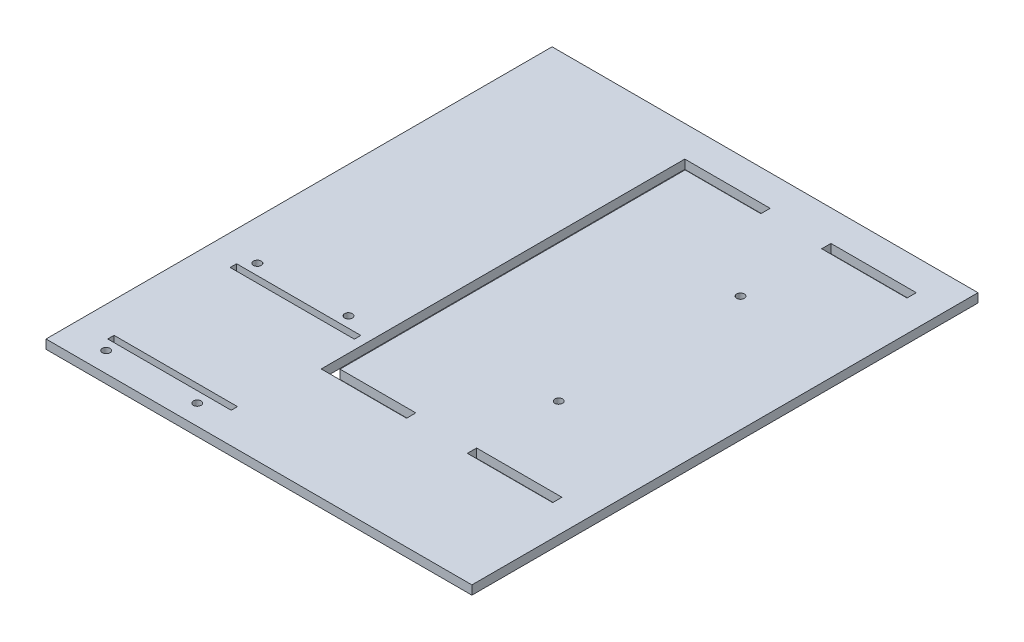
ISO-10303-21;
HEADER;
FILE_DESCRIPTION(('STEP AP214'),'2;1');
FILE_NAME('part.step','',(''),(''),'','','');
FILE_SCHEMA(('AUTOMOTIVE_DESIGN { 1 0 10303 214 1 1 1 1 }'));
ENDSEC;
DATA;
#1=APPLICATION_CONTEXT('core data for automotive mechanical design processes');
#2=APPLICATION_PROTOCOL_DEFINITION('international standard','automotive_design',2000,#1);
#3=PRODUCT_CONTEXT('',#1,'mechanical');
#4=PRODUCT('Part','Part','',(#3));
#5=PRODUCT_RELATED_PRODUCT_CATEGORY('part','',(#4));
#6=PRODUCT_DEFINITION_FORMATION('','',#4);
#7=PRODUCT_DEFINITION_CONTEXT('part definition',#1,'design');
#8=PRODUCT_DEFINITION('design','',#6,#7);
#9=PRODUCT_DEFINITION_SHAPE('','',#8);
#10=(LENGTH_UNIT() NAMED_UNIT(*) SI_UNIT(.MILLI.,.METRE.));
#11=(NAMED_UNIT(*) PLANE_ANGLE_UNIT() SI_UNIT($,.RADIAN.));
#12=(NAMED_UNIT(*) SI_UNIT($,.STERADIAN.) SOLID_ANGLE_UNIT());
#13=UNCERTAINTY_MEASURE_WITH_UNIT(LENGTH_MEASURE(1.E-05),#10,'distance_accuracy_value','');
#14=(GEOMETRIC_REPRESENTATION_CONTEXT(3) GLOBAL_UNCERTAINTY_ASSIGNED_CONTEXT((#13)) GLOBAL_UNIT_ASSIGNED_CONTEXT((#10,
#11,#12)) REPRESENTATION_CONTEXT('',''));
#15=CARTESIAN_POINT('',(0.,0.,0.));
#16=DIRECTION('',(0.,0.,1.));
#17=DIRECTION('',(1.,0.,0.));
#18=AXIS2_PLACEMENT_3D('',#15,#16,#17);
#19=CARTESIAN_POINT('',(0.,217.220590658261,352.461404447566));
#20=DIRECTION('',(0.,0.,-1.));
#21=DIRECTION('',(-1.,0.,0.));
#22=AXIS2_PLACEMENT_3D('',#19,#20,#21);
#23=PLANE('',#22);
#24=DIRECTION('',(0.,-1.,0.));
#25=VECTOR('',#24,1.);
#26=CARTESIAN_POINT('',(-40.25,217.220590658261,352.461404447566));
#27=LINE('',#26,#25);
#28=CARTESIAN_POINT('',(-40.25,2.90000000000001,352.461404447566));
#29=VERTEX_POINT('',#28);
#30=CARTESIAN_POINT('',(-40.25,0.,352.461404447566));
#31=VERTEX_POINT('',#30);
#32=EDGE_CURVE('E305',#29,#31,#27,.T.);
#33=ORIENTED_EDGE('',*,*,#32,.F.);
#34=DIRECTION('',(1.,0.,0.));
#35=VECTOR('',#34,1.);
#36=CARTESIAN_POINT('',(0.,2.90000000000001,352.461404447566));
#37=LINE('',#36,#35);
#38=CARTESIAN_POINT('',(0.,2.90000000000001,352.461404447566));
#39=VERTEX_POINT('',#38);
#40=EDGE_CURVE('E541',#29,#39,#37,.T.);
#41=ORIENTED_EDGE('',*,*,#40,.T.);
#42=DIRECTION('',(0.,-1.,0.));
#43=VECTOR('',#42,1.);
#44=CARTESIAN_POINT('',(0.,217.220590658261,352.461404447566));
#45=LINE('',#44,#43);
#46=CARTESIAN_POINT('',(0.,0.,352.461404447566));
#47=VERTEX_POINT('',#46);
#48=EDGE_CURVE('E303',#39,#47,#45,.T.);
#49=ORIENTED_EDGE('',*,*,#48,.T.);
#50=DIRECTION('',(1.,0.,0.));
#51=VECTOR('',#50,1.);
#52=CARTESIAN_POINT('',(0.,0.,352.461404447566));
#53=LINE('',#52,#51);
#54=EDGE_CURVE('E300',#31,#47,#53,.T.);
#55=ORIENTED_EDGE('',*,*,#54,.F.);
#56=EDGE_LOOP('',(#33,#41,#49,#55));
#57=FACE_BOUND('',#56,.T.);
#58=ADVANCED_FACE('F38',(#57),#23,.T.);
#59=CARTESIAN_POINT('',(-40.25,217.220590658261,350.361404447566));
#60=DIRECTION('',(1.,0.,0.));
#61=DIRECTION('',(0.,0.,-1.));
#62=AXIS2_PLACEMENT_3D('',#59,#60,#61);
#63=PLANE('',#62);
#64=DIRECTION('',(0.,-1.,0.));
#65=VECTOR('',#64,1.);
#66=CARTESIAN_POINT('',(-40.25,217.220590658261,350.361404447566));
#67=LINE('',#66,#65);
#68=CARTESIAN_POINT('',(-40.25,2.90000000000001,350.361404447566));
#69=VERTEX_POINT('',#68);
#70=CARTESIAN_POINT('',(-40.25,0.,350.361404447566));
#71=VERTEX_POINT('',#70);
#72=EDGE_CURVE('E307',#69,#71,#67,.T.);
#73=ORIENTED_EDGE('',*,*,#72,.F.);
#74=DIRECTION('',(0.,0.,1.));
#75=VECTOR('',#74,1.);
#76=CARTESIAN_POINT('',(-40.25,2.90000000000001,350.361404447566));
#77=LINE('',#76,#75);
#78=EDGE_CURVE('E544',#69,#29,#77,.T.);
#79=ORIENTED_EDGE('',*,*,#78,.T.);
#80=ORIENTED_EDGE('',*,*,#32,.T.);
#81=DIRECTION('',(0.,0.,1.));
#82=VECTOR('',#81,1.);
#83=CARTESIAN_POINT('',(-40.25,0.,350.361404447566));
#84=LINE('',#83,#82);
#85=EDGE_CURVE('E297',#71,#31,#84,.T.);
#86=ORIENTED_EDGE('',*,*,#85,.F.);
#87=EDGE_LOOP('',(#73,#79,#80,#86));
#88=FACE_BOUND('',#87,.T.);
#89=ADVANCED_FACE('F460',(#88),#63,.T.);
#90=CARTESIAN_POINT('',(0.,217.220590658261,350.361404447566));
#91=DIRECTION('',(0.,0.,1.));
#92=DIRECTION('',(1.,0.,0.));
#93=AXIS2_PLACEMENT_3D('',#90,#91,#92);
#94=PLANE('',#93);
#95=DIRECTION('',(0.,-1.,0.));
#96=VECTOR('',#95,1.);
#97=CARTESIAN_POINT('',(0.,217.220590658261,350.361404447566));
#98=LINE('',#97,#96);
#99=CARTESIAN_POINT('',(0.,2.90000000000001,350.361404447566));
#100=VERTEX_POINT('',#99);
#101=CARTESIAN_POINT('',(0.,0.,350.361404447566));
#102=VERTEX_POINT('',#101);
#103=EDGE_CURVE('E309',#100,#102,#98,.T.);
#104=ORIENTED_EDGE('',*,*,#103,.F.);
#105=DIRECTION('',(-1.,0.,0.));
#106=VECTOR('',#105,1.);
#107=CARTESIAN_POINT('',(0.,2.90000000000001,350.361404447566));
#108=LINE('',#107,#106);
#109=EDGE_CURVE('E550',#100,#69,#108,.T.);
#110=ORIENTED_EDGE('',*,*,#109,.T.);
#111=ORIENTED_EDGE('',*,*,#72,.T.);
#112=DIRECTION('',(-1.,0.,0.));
#113=VECTOR('',#112,1.);
#114=CARTESIAN_POINT('',(0.,0.,350.361404447566));
#115=LINE('',#114,#113);
#116=EDGE_CURVE('E293',#102,#71,#115,.T.);
#117=ORIENTED_EDGE('',*,*,#116,.F.);
#118=EDGE_LOOP('',(#104,#110,#111,#117));
#119=FACE_BOUND('',#118,.T.);
#120=ADVANCED_FACE('F466',(#119),#94,.T.);
#121=CARTESIAN_POINT('',(0.,217.220590658261,350.361404447566));
#122=DIRECTION('',(-1.,0.,0.));
#123=DIRECTION('',(0.,0.,1.));
#124=AXIS2_PLACEMENT_3D('',#121,#122,#123);
#125=PLANE('',#124);
#126=ORIENTED_EDGE('',*,*,#48,.F.);
#127=DIRECTION('',(0.,0.,-1.));
#128=VECTOR('',#127,1.);
#129=CARTESIAN_POINT('',(0.,2.90000000000001,350.361404447566));
#130=LINE('',#129,#128);
#131=EDGE_CURVE('E553',#39,#100,#130,.T.);
#132=ORIENTED_EDGE('',*,*,#131,.T.);
#133=ORIENTED_EDGE('',*,*,#103,.T.);
#134=DIRECTION('',(0.,0.,-1.));
#135=VECTOR('',#134,1.);
#136=CARTESIAN_POINT('',(0.,0.,350.361404447566));
#137=LINE('',#136,#135);
#138=EDGE_CURVE('E290',#47,#102,#137,.T.);
#139=ORIENTED_EDGE('',*,*,#138,.F.);
#140=EDGE_LOOP('',(#126,#132,#133,#139));
#141=FACE_BOUND('',#140,.T.);
#142=ADVANCED_FACE('F476',(#141),#125,.T.);
#143=CARTESIAN_POINT('',(77.9999999999991,217.220590658261,366.185034122256));
#144=DIRECTION('',(0.,0.,-1.));
#145=DIRECTION('',(-1.,0.,0.));
#146=AXIS2_PLACEMENT_3D('',#143,#144,#145);
#147=PLANE('',#146);
#148=DIRECTION('',(0.,-1.,0.));
#149=VECTOR('',#148,1.);
#150=CARTESIAN_POINT('',(50.3499999999992,217.220590658261,366.185034122256));
#151=LINE('',#150,#149);
#152=CARTESIAN_POINT('',(50.3499999999992,2.90000000000001,366.185034122256));
#153=VERTEX_POINT('',#152);
#154=CARTESIAN_POINT('',(50.3499999999992,0.,366.185034122256));
#155=VERTEX_POINT('',#154);
#156=EDGE_CURVE('E323',#153,#155,#151,.T.);
#157=ORIENTED_EDGE('',*,*,#156,.F.);
#158=DIRECTION('',(1.,0.,0.));
#159=VECTOR('',#158,1.);
#160=CARTESIAN_POINT('',(77.9999999999991,2.90000000000001,366.185034122256));
#161=LINE('',#160,#159);
#162=CARTESIAN_POINT('',(77.9999999999991,2.90000000000001,366.185034122256));
#163=VERTEX_POINT('',#162);
#164=EDGE_CURVE('E405',#153,#163,#161,.T.);
#165=ORIENTED_EDGE('',*,*,#164,.T.);
#166=DIRECTION('',(0.,-1.,0.));
#167=VECTOR('',#166,1.);
#168=CARTESIAN_POINT('',(77.9999999999991,217.220590658261,366.185034122256));
#169=LINE('',#168,#167);
#170=CARTESIAN_POINT('',(77.9999999999991,0.,366.185034122256));
#171=VERTEX_POINT('',#170);
#172=EDGE_CURVE('E321',#163,#171,#169,.T.);
#173=ORIENTED_EDGE('',*,*,#172,.T.);
#174=DIRECTION('',(1.,0.,0.));
#175=VECTOR('',#174,1.);
#176=CARTESIAN_POINT('',(77.9999999999991,0.,366.185034122256));
#177=LINE('',#176,#175);
#178=EDGE_CURVE('E318',#155,#171,#177,.T.);
#179=ORIENTED_EDGE('',*,*,#178,.F.);
#180=EDGE_LOOP('',(#157,#165,#173,#179));
#181=FACE_BOUND('',#180,.T.);
#182=ADVANCED_FACE('F480',(#181),#147,.T.);
#183=CARTESIAN_POINT('',(50.3499999999992,217.220590658261,363.185034122256));
#184=DIRECTION('',(1.,0.,0.));
#185=DIRECTION('',(0.,0.,-1.));
#186=AXIS2_PLACEMENT_3D('',#183,#184,#185);
#187=PLANE('',#186);
#188=DIRECTION('',(0.,-1.,0.));
#189=VECTOR('',#188,1.);
#190=CARTESIAN_POINT('',(50.3499999999992,217.220590658261,363.185034122256));
#191=LINE('',#190,#189);
#192=CARTESIAN_POINT('',(50.3499999999992,2.90000000000001,363.185034122256));
#193=VERTEX_POINT('',#192);
#194=CARTESIAN_POINT('',(50.3499999999992,0.,363.185034122256));
#195=VERTEX_POINT('',#194);
#196=EDGE_CURVE('E326',#193,#195,#191,.T.);
#197=ORIENTED_EDGE('',*,*,#196,.F.);
#198=DIRECTION('',(0.,0.,1.));
#199=VECTOR('',#198,1.);
#200=CARTESIAN_POINT('',(50.3499999999992,2.90000000000001,363.185034122256));
#201=LINE('',#200,#199);
#202=EDGE_CURVE('E402',#193,#153,#201,.T.);
#203=ORIENTED_EDGE('',*,*,#202,.T.);
#204=ORIENTED_EDGE('',*,*,#156,.T.);
#205=DIRECTION('',(0.,0.,1.));
#206=VECTOR('',#205,1.);
#207=CARTESIAN_POINT('',(50.3499999999992,0.,0.));
#208=LINE('',#207,#206);
#209=EDGE_CURVE('E317',#195,#155,#208,.T.);
#210=ORIENTED_EDGE('',*,*,#209,.F.);
#211=EDGE_LOOP('',(#197,#203,#204,#210));
#212=FACE_BOUND('',#211,.T.);
#213=ADVANCED_FACE('F40',(#212),#187,.T.);
#214=CARTESIAN_POINT('',(77.9999999999991,217.220590658261,363.185034122256));
#215=DIRECTION('',(0.,0.,1.));
#216=DIRECTION('',(1.,0.,0.));
#217=AXIS2_PLACEMENT_3D('',#214,#215,#216);
#218=PLANE('',#217);
#219=DIRECTION('',(0.,-1.,0.));
#220=VECTOR('',#219,1.);
#221=CARTESIAN_POINT('',(77.9999999999991,217.220590658261,363.185034122256));
#222=LINE('',#221,#220);
#223=CARTESIAN_POINT('',(77.9999999999991,2.90000000000001,363.185034122256));
#224=VERTEX_POINT('',#223);
#225=CARTESIAN_POINT('',(77.9999999999991,0.,363.185034122256));
#226=VERTEX_POINT('',#225);
#227=EDGE_CURVE('E324',#224,#226,#222,.T.);
#228=ORIENTED_EDGE('',*,*,#227,.F.);
#229=DIRECTION('',(-1.,0.,0.));
#230=VECTOR('',#229,1.);
#231=CARTESIAN_POINT('',(77.9999999999991,2.90000000000001,363.185034122256));
#232=LINE('',#231,#230);
#233=EDGE_CURVE('E243',#224,#193,#232,.T.);
#234=ORIENTED_EDGE('',*,*,#233,.T.);
#235=ORIENTED_EDGE('',*,*,#196,.T.);
#236=DIRECTION('',(-1.,0.,0.));
#237=VECTOR('',#236,1.);
#238=CARTESIAN_POINT('',(77.9999999999991,0.,363.185034122256));
#239=LINE('',#238,#237);
#240=EDGE_CURVE('E314',#226,#195,#239,.T.);
#241=ORIENTED_EDGE('',*,*,#240,.F.);
#242=EDGE_LOOP('',(#228,#234,#235,#241));
#243=FACE_BOUND('',#242,.T.);
#244=ADVANCED_FACE('F485',(#243),#218,.T.);
#245=CARTESIAN_POINT('',(77.9999999999991,217.220590658261,366.185034122256));
#246=DIRECTION('',(-1.,0.,0.));
#247=DIRECTION('',(0.,0.,1.));
#248=AXIS2_PLACEMENT_3D('',#245,#246,#247);
#249=PLANE('',#248);
#250=ORIENTED_EDGE('',*,*,#172,.F.);
#251=DIRECTION('',(0.,0.,-1.));
#252=VECTOR('',#251,1.);
#253=CARTESIAN_POINT('',(77.9999999999991,2.90000000000001,366.185034122256));
#254=LINE('',#253,#252);
#255=EDGE_CURVE('E239',#163,#224,#254,.T.);
#256=ORIENTED_EDGE('',*,*,#255,.T.);
#257=ORIENTED_EDGE('',*,*,#227,.T.);
#258=DIRECTION('',(0.,0.,-1.));
#259=VECTOR('',#258,1.);
#260=CARTESIAN_POINT('',(77.9999999999991,0.,366.185034122256));
#261=LINE('',#260,#259);
#262=EDGE_CURVE('E311',#171,#226,#261,.T.);
#263=ORIENTED_EDGE('',*,*,#262,.F.);
#264=EDGE_LOOP('',(#250,#256,#257,#263));
#265=FACE_BOUND('',#264,.T.);
#266=ADVANCED_FACE('F488',(#265),#249,.T.);
#267=CARTESIAN_POINT('',(-40.,217.220590658261,390.311404447566));
#268=DIRECTION('',(0.,0.,1.));
#269=DIRECTION('',(1.,0.,0.));
#270=AXIS2_PLACEMENT_3D('',#267,#268,#269);
#271=PLANE('',#270);
#272=DIRECTION('',(0.,-1.,0.));
#273=VECTOR('',#272,1.);
#274=CARTESIAN_POINT('',(0.,217.220590658261,390.311404447566));
#275=LINE('',#274,#273);
#276=CARTESIAN_POINT('',(0.,2.90000000000001,390.311404447566));
#277=VERTEX_POINT('',#276);
#278=CARTESIAN_POINT('',(0.,0.,390.311404447566));
#279=VERTEX_POINT('',#278);
#280=EDGE_CURVE('E233',#277,#279,#275,.T.);
#281=ORIENTED_EDGE('',*,*,#280,.F.);
#282=DIRECTION('',(-1.,0.,0.));
#283=VECTOR('',#282,1.);
#284=CARTESIAN_POINT('',(-40.,2.90000000000001,390.311404447566));
#285=LINE('',#284,#283);
#286=CARTESIAN_POINT('',(-40.,2.90000000000001,390.311404447566));
#287=VERTEX_POINT('',#286);
#288=EDGE_CURVE('E218',#277,#287,#285,.T.);
#289=ORIENTED_EDGE('',*,*,#288,.T.);
#290=DIRECTION('',(0.,-1.,0.));
#291=VECTOR('',#290,1.);
#292=CARTESIAN_POINT('',(-40.,217.220590658261,390.311404447566));
#293=LINE('',#292,#291);
#294=CARTESIAN_POINT('',(-40.,0.,390.311404447566));
#295=VERTEX_POINT('',#294);
#296=EDGE_CURVE('E226',#287,#295,#293,.T.);
#297=ORIENTED_EDGE('',*,*,#296,.T.);
#298=DIRECTION('',(-1.,0.,0.));
#299=VECTOR('',#298,1.);
#300=CARTESIAN_POINT('',(-40.,0.,390.311404447566));
#301=LINE('',#300,#299);
#302=EDGE_CURVE('E234',#279,#295,#301,.T.);
#303=ORIENTED_EDGE('',*,*,#302,.F.);
#304=EDGE_LOOP('',(#281,#289,#297,#303));
#305=FACE_BOUND('',#304,.T.);
#306=ADVANCED_FACE('F237',(#305),#271,.T.);
#307=CARTESIAN_POINT('',(0.,217.220590658261,392.361404447566));
#308=DIRECTION('',(-1.,0.,0.));
#309=DIRECTION('',(0.,0.,1.));
#310=AXIS2_PLACEMENT_3D('',#307,#308,#309);
#311=PLANE('',#310);
#312=DIRECTION('',(0.,-1.,0.));
#313=VECTOR('',#312,1.);
#314=CARTESIAN_POINT('',(0.,217.220590658261,392.361404447566));
#315=LINE('',#314,#313);
#316=CARTESIAN_POINT('',(0.,2.90000000000001,392.361404447566));
#317=VERTEX_POINT('',#316);
#318=CARTESIAN_POINT('',(0.,0.,392.361404447566));
#319=VERTEX_POINT('',#318);
#320=EDGE_CURVE('E336',#317,#319,#315,.T.);
#321=ORIENTED_EDGE('',*,*,#320,.F.);
#322=DIRECTION('',(0.,0.,-1.));
#323=VECTOR('',#322,1.);
#324=CARTESIAN_POINT('',(0.,2.90000000000001,392.361404447566));
#325=LINE('',#324,#323);
#326=EDGE_CURVE('E238',#317,#277,#325,.T.);
#327=ORIENTED_EDGE('',*,*,#326,.T.);
#328=ORIENTED_EDGE('',*,*,#280,.T.);
#329=DIRECTION('',(0.,0.,-1.));
#330=VECTOR('',#329,1.);
#331=CARTESIAN_POINT('',(0.,0.,392.361404447566));
#332=LINE('',#331,#330);
#333=EDGE_CURVE('E331',#319,#279,#332,.T.);
#334=ORIENTED_EDGE('',*,*,#333,.F.);
#335=EDGE_LOOP('',(#321,#327,#328,#334));
#336=FACE_BOUND('',#335,.T.);
#337=ADVANCED_FACE('F495',(#336),#311,.T.);
#338=CARTESIAN_POINT('',(-40.,217.220590658261,392.361404447566));
#339=DIRECTION('',(0.,0.,-1.));
#340=DIRECTION('',(-1.,0.,0.));
#341=AXIS2_PLACEMENT_3D('',#338,#339,#340);
#342=PLANE('',#341);
#343=DIRECTION('',(0.,-1.,0.));
#344=VECTOR('',#343,1.);
#345=CARTESIAN_POINT('',(-40.,217.220590658261,392.361404447566));
#346=LINE('',#345,#344);
#347=CARTESIAN_POINT('',(-40.,2.90000000000001,392.361404447566));
#348=VERTEX_POINT('',#347);
#349=CARTESIAN_POINT('',(-40.,0.,392.361404447566));
#350=VERTEX_POINT('',#349);
#351=EDGE_CURVE('E338',#348,#350,#346,.T.);
#352=ORIENTED_EDGE('',*,*,#351,.F.);
#353=DIRECTION('',(1.,0.,0.));
#354=VECTOR('',#353,1.);
#355=CARTESIAN_POINT('',(-40.,2.90000000000001,392.361404447566));
#356=LINE('',#355,#354);
#357=EDGE_CURVE('E221',#348,#317,#356,.T.);
#358=ORIENTED_EDGE('',*,*,#357,.T.);
#359=ORIENTED_EDGE('',*,*,#320,.T.);
#360=DIRECTION('',(1.,0.,0.));
#361=VECTOR('',#360,1.);
#362=CARTESIAN_POINT('',(-40.,0.,392.361404447566));
#363=LINE('',#362,#361);
#364=EDGE_CURVE('E328',#350,#319,#363,.T.);
#365=ORIENTED_EDGE('',*,*,#364,.F.);
#366=EDGE_LOOP('',(#352,#358,#359,#365));
#367=FACE_BOUND('',#366,.T.);
#368=ADVANCED_FACE('F457',(#367),#342,.T.);
#369=CARTESIAN_POINT('',(-40.,217.220590658261,392.361404447566));
#370=DIRECTION('',(1.,0.,0.));
#371=DIRECTION('',(0.,0.,-1.));
#372=AXIS2_PLACEMENT_3D('',#369,#370,#371);
#373=PLANE('',#372);
#374=ORIENTED_EDGE('',*,*,#296,.F.);
#375=DIRECTION('',(0.,0.,1.));
#376=VECTOR('',#375,1.);
#377=CARTESIAN_POINT('',(-40.,2.90000000000001,392.361404447566));
#378=LINE('',#377,#376);
#379=EDGE_CURVE('E212',#287,#348,#378,.T.);
#380=ORIENTED_EDGE('',*,*,#379,.T.);
#381=ORIENTED_EDGE('',*,*,#351,.T.);
#382=DIRECTION('',(0.,0.,1.));
#383=VECTOR('',#382,1.);
#384=CARTESIAN_POINT('',(-40.,0.,392.361404447566));
#385=LINE('',#384,#383);
#386=EDGE_CURVE('E229',#295,#350,#385,.T.);
#387=ORIENTED_EDGE('',*,*,#386,.F.);
#388=EDGE_LOOP('',(#374,#380,#381,#387));
#389=FACE_BOUND('',#388,.T.);
#390=ADVANCED_FACE('F227',(#389),#373,.T.);
#391=CARTESIAN_POINT('',(2.99999999999992,217.220590658261,248.38178504288));
#392=DIRECTION('',(1.,0.,0.));
#393=DIRECTION('',(0.,0.,-1.));
#394=AXIS2_PLACEMENT_3D('',#391,#392,#393);
#395=PLANE('',#394);
#396=DIRECTION('',(0.,-1.,0.));
#397=VECTOR('',#396,1.);
#398=CARTESIAN_POINT('',(2.99999999999992,217.220590658261,248.38178504288));
#399=LINE('',#398,#397);
#400=CARTESIAN_POINT('',(2.99999999999992,2.90000000000001,248.38178504288));
#401=VERTEX_POINT('',#400);
#402=CARTESIAN_POINT('',(2.99999999999992,0.,248.38178504288));
#403=VERTEX_POINT('',#402);
#404=EDGE_CURVE('E362',#401,#403,#399,.T.);
#405=ORIENTED_EDGE('',*,*,#404,.F.);
#406=DIRECTION('',(0.,0.,1.));
#407=VECTOR('',#406,1.);
#408=CARTESIAN_POINT('',(2.99999999999992,2.90000000000001,248.38178504288));
#409=LINE('',#408,#407);
#410=CARTESIAN_POINT('',(2.99999999999992,2.90000000000001,366.185034122256));
#411=VERTEX_POINT('',#410);
#412=EDGE_CURVE('E131',#401,#411,#409,.T.);
#413=ORIENTED_EDGE('',*,*,#412,.T.);
#414=DIRECTION('',(0.,-1.,0.));
#415=VECTOR('',#414,1.);
#416=CARTESIAN_POINT('',(2.99999999999992,217.220590658261,366.185034122256));
#417=LINE('',#416,#415);
#418=CARTESIAN_POINT('',(2.99999999999992,0.,366.185034122256));
#419=VERTEX_POINT('',#418);
#420=EDGE_CURVE('E360',#411,#419,#417,.T.);
#421=ORIENTED_EDGE('',*,*,#420,.T.);
#422=DIRECTION('',(0.,0.,1.));
#423=VECTOR('',#422,1.);
#424=CARTESIAN_POINT('',(2.99999999999992,0.,248.38178504288));
#425=LINE('',#424,#423);
#426=EDGE_CURVE('E357',#403,#419,#425,.T.);
#427=ORIENTED_EDGE('',*,*,#426,.F.);
#428=EDGE_LOOP('',(#405,#413,#421,#427));
#429=FACE_BOUND('',#428,.T.);
#430=ADVANCED_FACE('F449',(#429),#395,.T.);
#431=CARTESIAN_POINT('',(2.99999999999992,217.220590658261,248.38178504288));
#432=DIRECTION('',(0.,0.,1.));
#433=DIRECTION('',(1.,0.,0.));
#434=AXIS2_PLACEMENT_3D('',#431,#432,#433);
#435=PLANE('',#434);
#436=DIRECTION('',(0.,-1.,0.));
#437=VECTOR('',#436,1.);
#438=CARTESIAN_POINT('',(30.6499999999991,217.220590658261,248.38178504288));
#439=LINE('',#438,#437);
#440=CARTESIAN_POINT('',(30.6499999999991,2.90000000000001,248.38178504288));
#441=VERTEX_POINT('',#440);
#442=CARTESIAN_POINT('',(30.6499999999991,0.,248.38178504288));
#443=VERTEX_POINT('',#442);
#444=EDGE_CURVE('E364',#441,#443,#439,.T.);
#445=ORIENTED_EDGE('',*,*,#444,.F.);
#446=DIRECTION('',(-1.,0.,0.));
#447=VECTOR('',#446,1.);
#448=CARTESIAN_POINT('',(2.99999999999992,2.90000000000001,248.38178504288));
#449=LINE('',#448,#447);
#450=EDGE_CURVE('E125',#441,#401,#449,.T.);
#451=ORIENTED_EDGE('',*,*,#450,.T.);
#452=ORIENTED_EDGE('',*,*,#404,.T.);
#453=DIRECTION('',(-1.,0.,0.));
#454=VECTOR('',#453,1.);
#455=CARTESIAN_POINT('',(2.99999999999992,0.,248.38178504288));
#456=LINE('',#455,#454);
#457=EDGE_CURVE('E354',#443,#403,#456,.T.);
#458=ORIENTED_EDGE('',*,*,#457,.F.);
#459=EDGE_LOOP('',(#445,#451,#452,#458));
#460=FACE_BOUND('',#459,.T.);
#461=ADVANCED_FACE('F421',(#460),#435,.T.);
#462=CARTESIAN_POINT('',(30.6499999999991,217.220590658261,248.38178504288));
#463=DIRECTION('',(-1.,0.,0.));
#464=DIRECTION('',(0.,0.,1.));
#465=AXIS2_PLACEMENT_3D('',#462,#463,#464);
#466=PLANE('',#465);
#467=DIRECTION('',(0.,-1.,0.));
#468=VECTOR('',#467,1.);
#469=CARTESIAN_POINT('',(30.6499999999991,217.220590658261,251.38178504288));
#470=LINE('',#469,#468);
#471=CARTESIAN_POINT('',(30.6499999999991,2.90000000000001,251.38178504288));
#472=VERTEX_POINT('',#471);
#473=CARTESIAN_POINT('',(30.6499999999991,0.,251.38178504288));
#474=VERTEX_POINT('',#473);
#475=EDGE_CURVE('E368',#472,#474,#470,.T.);
#476=ORIENTED_EDGE('',*,*,#475,.F.);
#477=DIRECTION('',(0.,0.,-1.));
#478=VECTOR('',#477,1.);
#479=CARTESIAN_POINT('',(30.6499999999991,2.90000000000001,248.38178504288));
#480=LINE('',#479,#478);
#481=EDGE_CURVE('E42',#472,#441,#480,.T.);
#482=ORIENTED_EDGE('',*,*,#481,.T.);
#483=ORIENTED_EDGE('',*,*,#444,.T.);
#484=DIRECTION('',(0.,0.,-1.));
#485=VECTOR('',#484,1.);
#486=CARTESIAN_POINT('',(30.6499999999991,0.,0.));
#487=LINE('',#486,#485);
#488=EDGE_CURVE('E353',#474,#443,#487,.T.);
#489=ORIENTED_EDGE('',*,*,#488,.F.);
#490=EDGE_LOOP('',(#476,#482,#483,#489));
#491=FACE_BOUND('',#490,.T.);
#492=ADVANCED_FACE('F419',(#491),#466,.T.);
#493=CARTESIAN_POINT('',(6.0999999999999,217.220590658261,251.38178504288));
#494=DIRECTION('',(0.,0.,-1.));
#495=DIRECTION('',(-1.,0.,0.));
#496=AXIS2_PLACEMENT_3D('',#493,#494,#495);
#497=PLANE('',#496);
#498=DIRECTION('',(0.,-1.,0.));
#499=VECTOR('',#498,1.);
#500=CARTESIAN_POINT('',(6.0999999999999,217.220590658261,251.38178504288));
#501=LINE('',#500,#499);
#502=CARTESIAN_POINT('',(6.0999999999999,2.90000000000001,251.38178504288));
#503=VERTEX_POINT('',#502);
#504=CARTESIAN_POINT('',(6.0999999999999,0.,251.38178504288));
#505=VERTEX_POINT('',#504);
#506=EDGE_CURVE('E365',#503,#505,#501,.T.);
#507=ORIENTED_EDGE('',*,*,#506,.F.);
#508=DIRECTION('',(1.,0.,0.));
#509=VECTOR('',#508,1.);
#510=CARTESIAN_POINT('',(6.0999999999999,2.90000000000001,251.38178504288));
#511=LINE('',#510,#509);
#512=EDGE_CURVE('E250',#503,#472,#511,.T.);
#513=ORIENTED_EDGE('',*,*,#512,.T.);
#514=ORIENTED_EDGE('',*,*,#475,.T.);
#515=DIRECTION('',(1.,0.,0.));
#516=VECTOR('',#515,1.);
#517=CARTESIAN_POINT('',(6.0999999999999,0.,251.38178504288));
#518=LINE('',#517,#516);
#519=EDGE_CURVE('E350',#505,#474,#518,.T.);
#520=ORIENTED_EDGE('',*,*,#519,.F.);
#521=EDGE_LOOP('',(#507,#513,#514,#520));
#522=FACE_BOUND('',#521,.T.);
#523=ADVANCED_FACE('F431',(#522),#497,.T.);
#524=CARTESIAN_POINT('',(6.09999999999992,217.220590658261,363.185034122256));
#525=DIRECTION('',(-1.,0.,0.));
#526=DIRECTION('',(0.,0.,1.));
#527=AXIS2_PLACEMENT_3D('',#524,#525,#526);
#528=PLANE('',#527);
#529=DIRECTION('',(0.,-1.,0.));
#530=VECTOR('',#529,1.);
#531=CARTESIAN_POINT('',(6.09999999999992,217.220590658261,363.185034122256));
#532=LINE('',#531,#530);
#533=CARTESIAN_POINT('',(6.09999999999992,2.90000000000001,363.185034122256));
#534=VERTEX_POINT('',#533);
#535=CARTESIAN_POINT('',(6.09999999999992,0.,363.185034122256));
#536=VERTEX_POINT('',#535);
#537=EDGE_CURVE('E367',#534,#536,#532,.T.);
#538=ORIENTED_EDGE('',*,*,#537,.F.);
#539=DIRECTION('',(0.,0.,-1.));
#540=VECTOR('',#539,1.);
#541=CARTESIAN_POINT('',(6.09999999999992,2.90000000000001,363.185034122256));
#542=LINE('',#541,#540);
#543=EDGE_CURVE('E253',#534,#503,#542,.T.);
#544=ORIENTED_EDGE('',*,*,#543,.T.);
#545=ORIENTED_EDGE('',*,*,#506,.T.);
#546=DIRECTION('',(0.,0.,-1.));
#547=VECTOR('',#546,1.);
#548=CARTESIAN_POINT('',(6.09999999999992,0.,363.185034122256));
#549=LINE('',#548,#547);
#550=EDGE_CURVE('E347',#536,#505,#549,.T.);
#551=ORIENTED_EDGE('',*,*,#550,.F.);
#552=EDGE_LOOP('',(#538,#544,#545,#551));
#553=FACE_BOUND('',#552,.T.);
#554=ADVANCED_FACE('F436',(#553),#528,.T.);
#555=CARTESIAN_POINT('',(30.4999999999991,217.220590658261,363.185034122256));
#556=DIRECTION('',(0.,0.,1.));
#557=DIRECTION('',(1.,0.,0.));
#558=AXIS2_PLACEMENT_3D('',#555,#556,#557);
#559=PLANE('',#558);
#560=DIRECTION('',(0.,-1.,0.));
#561=VECTOR('',#560,1.);
#562=CARTESIAN_POINT('',(30.6499999999991,217.220590658261,363.185034122256));
#563=LINE('',#562,#561);
#564=CARTESIAN_POINT('',(30.6499999999991,2.90000000000001,363.185034122256));
#565=VERTEX_POINT('',#564);
#566=CARTESIAN_POINT('',(30.6499999999991,0.,363.185034122256));
#567=VERTEX_POINT('',#566);
#568=EDGE_CURVE('E370',#565,#567,#563,.T.);
#569=ORIENTED_EDGE('',*,*,#568,.F.);
#570=DIRECTION('',(-1.,0.,0.));
#571=VECTOR('',#570,1.);
#572=CARTESIAN_POINT('',(30.4999999999991,2.90000000000001,363.185034122256));
#573=LINE('',#572,#571);
#574=EDGE_CURVE('E256',#565,#534,#573,.T.);
#575=ORIENTED_EDGE('',*,*,#574,.T.);
#576=ORIENTED_EDGE('',*,*,#537,.T.);
#577=DIRECTION('',(-1.,0.,0.));
#578=VECTOR('',#577,1.);
#579=CARTESIAN_POINT('',(30.4999999999991,0.,363.185034122256));
#580=LINE('',#579,#578);
#581=EDGE_CURVE('E344',#567,#536,#580,.T.);
#582=ORIENTED_EDGE('',*,*,#581,.F.);
#583=EDGE_LOOP('',(#569,#575,#576,#582));
#584=FACE_BOUND('',#583,.T.);
#585=ADVANCED_FACE('F439',(#584),#559,.T.);
#586=CARTESIAN_POINT('',(30.6499999999991,217.220590658261,366.185034122256));
#587=DIRECTION('',(-1.,0.,0.));
#588=DIRECTION('',(0.,0.,1.));
#589=AXIS2_PLACEMENT_3D('',#586,#587,#588);
#590=PLANE('',#589);
#591=DIRECTION('',(0.,-1.,0.));
#592=VECTOR('',#591,1.);
#593=CARTESIAN_POINT('',(30.6499999999991,217.220590658261,366.185034122256));
#594=LINE('',#593,#592);
#595=CARTESIAN_POINT('',(30.6499999999991,2.90000000000001,366.185034122256));
#596=VERTEX_POINT('',#595);
#597=CARTESIAN_POINT('',(30.6499999999991,0.,366.185034122256));
#598=VERTEX_POINT('',#597);
#599=EDGE_CURVE('E375',#596,#598,#594,.T.);
#600=ORIENTED_EDGE('',*,*,#599,.F.);
#601=DIRECTION('',(0.,0.,-1.));
#602=VECTOR('',#601,1.);
#603=CARTESIAN_POINT('',(30.6499999999991,2.90000000000001,366.185034122256));
#604=LINE('',#603,#602);
#605=EDGE_CURVE('E259',#596,#565,#604,.T.);
#606=ORIENTED_EDGE('',*,*,#605,.T.);
#607=ORIENTED_EDGE('',*,*,#568,.T.);
#608=DIRECTION('',(0.,0.,-1.));
#609=VECTOR('',#608,1.);
#610=CARTESIAN_POINT('',(30.6499999999991,0.,0.));
#611=LINE('',#610,#609);
#612=EDGE_CURVE('E343',#598,#567,#611,.T.);
#613=ORIENTED_EDGE('',*,*,#612,.F.);
#614=EDGE_LOOP('',(#600,#606,#607,#613));
#615=FACE_BOUND('',#614,.T.);
#616=ADVANCED_FACE('F443',(#615),#590,.T.);
#617=CARTESIAN_POINT('',(30.4999999999991,217.220590658261,366.185034122256));
#618=DIRECTION('',(0.,0.,-1.));
#619=DIRECTION('',(-1.,0.,0.));
#620=AXIS2_PLACEMENT_3D('',#617,#618,#619);
#621=PLANE('',#620);
#622=ORIENTED_EDGE('',*,*,#420,.F.);
#623=DIRECTION('',(1.,0.,0.));
#624=VECTOR('',#623,1.);
#625=CARTESIAN_POINT('',(30.4999999999991,2.90000000000001,366.185034122256));
#626=LINE('',#625,#624);
#627=EDGE_CURVE('E260',#411,#596,#626,.T.);
#628=ORIENTED_EDGE('',*,*,#627,.T.);
#629=ORIENTED_EDGE('',*,*,#599,.T.);
#630=DIRECTION('',(1.,0.,0.));
#631=VECTOR('',#630,1.);
#632=CARTESIAN_POINT('',(30.4999999999991,0.,366.185034122256));
#633=LINE('',#632,#631);
#634=EDGE_CURVE('E340',#419,#598,#633,.T.);
#635=ORIENTED_EDGE('',*,*,#634,.F.);
#636=EDGE_LOOP('',(#622,#628,#629,#635));
#637=FACE_BOUND('',#636,.T.);
#638=ADVANCED_FACE('F447',(#637),#621,.T.);
#639=CARTESIAN_POINT('',(-50.,217.220590658261,402.361404447566));
#640=DIRECTION('',(1.,0.,0.));
#641=DIRECTION('',(0.,0.,-1.));
#642=AXIS2_PLACEMENT_3D('',#639,#640,#641);
#643=PLANE('',#642);
#644=DIRECTION('',(0.,0.,1.));
#645=VECTOR('',#644,1.);
#646=CARTESIAN_POINT('',(-50.,2.90000000000001,402.361404447566));
#647=LINE('',#646,#645);
#648=CARTESIAN_POINT('',(-50.,2.90000000000001,238.38178504288));
#649=VERTEX_POINT('',#648);
#650=CARTESIAN_POINT('',(-50.,2.90000000000001,402.361404447566));
#651=VERTEX_POINT('',#650);
#652=EDGE_CURVE('E263',#649,#651,#647,.T.);
#653=ORIENTED_EDGE('',*,*,#652,.F.);
#654=DIRECTION('',(0.,-1.,0.));
#655=VECTOR('',#654,1.);
#656=CARTESIAN_POINT('',(-50.,217.220590658261,238.38178504288));
#657=LINE('',#656,#655);
#658=CARTESIAN_POINT('',(-50.,0.,238.38178504288));
#659=VERTEX_POINT('',#658);
#660=EDGE_CURVE('E57',#649,#659,#657,.T.);
#661=ORIENTED_EDGE('',*,*,#660,.T.);
#662=DIRECTION('',(0.,0.,1.));
#663=VECTOR('',#662,1.);
#664=CARTESIAN_POINT('',(-50.,0.,402.361404447566));
#665=LINE('',#664,#663);
#666=CARTESIAN_POINT('',(-50.,0.,402.361404447566));
#667=VERTEX_POINT('',#666);
#668=EDGE_CURVE('E380',#659,#667,#665,.T.);
#669=ORIENTED_EDGE('',*,*,#668,.T.);
#670=DIRECTION('',(0.,-1.,0.));
#671=VECTOR('',#670,1.);
#672=CARTESIAN_POINT('',(-50.,217.220590658261,402.361404447566));
#673=LINE('',#672,#671);
#674=EDGE_CURVE('E383',#651,#667,#673,.T.);
#675=ORIENTED_EDGE('',*,*,#674,.F.);
#676=EDGE_LOOP('',(#653,#661,#669,#675));
#677=FACE_BOUND('',#676,.T.);
#678=ADVANCED_FACE('F612',(#677),#643,.F.);
#679=CARTESIAN_POINT('',(-50.,217.220590658261,238.38178504288));
#680=DIRECTION('',(0.,0.,1.));
#681=DIRECTION('',(1.,0.,0.));
#682=AXIS2_PLACEMENT_3D('',#679,#680,#681);
#683=PLANE('',#682);
#684=DIRECTION('',(-1.,0.,0.));
#685=VECTOR('',#684,1.);
#686=CARTESIAN_POINT('',(-50.,2.90000000000001,238.38178504288));
#687=LINE('',#686,#685);
#688=CARTESIAN_POINT('',(87.9999999999991,2.90000000000001,238.381785042879));
#689=VERTEX_POINT('',#688);
#690=EDGE_CURVE('E266',#689,#649,#687,.T.);
#691=ORIENTED_EDGE('',*,*,#690,.F.);
#692=DIRECTION('',(0.,-1.,0.));
#693=VECTOR('',#692,1.);
#694=CARTESIAN_POINT('',(87.9999999999991,217.220590658261,238.381785042879));
#695=LINE('',#694,#693);
#696=CARTESIAN_POINT('',(87.9999999999991,0.,238.381785042879));
#697=VERTEX_POINT('',#696);
#698=EDGE_CURVE('E386',#689,#697,#695,.T.);
#699=ORIENTED_EDGE('',*,*,#698,.T.);
#700=DIRECTION('',(-1.,0.,0.));
#701=VECTOR('',#700,1.);
#702=CARTESIAN_POINT('',(-50.,0.,238.38178504288));
#703=LINE('',#702,#701);
#704=EDGE_CURVE('E378',#697,#659,#703,.T.);
#705=ORIENTED_EDGE('',*,*,#704,.T.);
#706=ORIENTED_EDGE('',*,*,#660,.F.);
#707=EDGE_LOOP('',(#691,#699,#705,#706));
#708=FACE_BOUND('',#707,.T.);
#709=ADVANCED_FACE('F623',(#708),#683,.F.);
#710=CARTESIAN_POINT('',(87.9999999999991,217.220590658261,238.381785042879));
#711=DIRECTION('',(-1.,0.,0.));
#712=DIRECTION('',(0.,0.,1.));
#713=AXIS2_PLACEMENT_3D('',#710,#711,#712);
#714=PLANE('',#713);
#715=DIRECTION('',(0.,0.,-1.));
#716=VECTOR('',#715,1.);
#717=CARTESIAN_POINT('',(87.9999999999991,2.90000000000001,238.381785042879));
#718=LINE('',#717,#716);
#719=CARTESIAN_POINT('',(87.9999999999991,2.90000000000001,402.361404447566));
#720=VERTEX_POINT('',#719);
#721=EDGE_CURVE('E269',#720,#689,#718,.T.);
#722=ORIENTED_EDGE('',*,*,#721,.F.);
#723=DIRECTION('',(0.,-1.,0.));
#724=VECTOR('',#723,1.);
#725=CARTESIAN_POINT('',(87.9999999999991,217.220590658261,402.361404447566));
#726=LINE('',#725,#724);
#727=CARTESIAN_POINT('',(87.9999999999991,0.,402.361404447566));
#728=VERTEX_POINT('',#727);
#729=EDGE_CURVE('E48',#720,#728,#726,.T.);
#730=ORIENTED_EDGE('',*,*,#729,.T.);
#731=DIRECTION('',(0.,0.,-1.));
#732=VECTOR('',#731,1.);
#733=CARTESIAN_POINT('',(87.9999999999991,0.,238.381785042879));
#734=LINE('',#733,#732);
#735=EDGE_CURVE('E374',#728,#697,#734,.T.);
#736=ORIENTED_EDGE('',*,*,#735,.T.);
#737=ORIENTED_EDGE('',*,*,#698,.F.);
#738=EDGE_LOOP('',(#722,#730,#736,#737));
#739=FACE_BOUND('',#738,.T.);
#740=ADVANCED_FACE('F626',(#739),#714,.F.);
#741=CARTESIAN_POINT('',(-50.,217.220590658261,402.361404447566));
#742=DIRECTION('',(0.,0.,-1.));
#743=DIRECTION('',(-1.,0.,0.));
#744=AXIS2_PLACEMENT_3D('',#741,#742,#743);
#745=PLANE('',#744);
#746=DIRECTION('',(1.,0.,0.));
#747=VECTOR('',#746,1.);
#748=CARTESIAN_POINT('',(-50.,2.90000000000001,402.361404447566));
#749=LINE('',#748,#747);
#750=EDGE_CURVE('E272',#651,#720,#749,.T.);
#751=ORIENTED_EDGE('',*,*,#750,.F.);
#752=ORIENTED_EDGE('',*,*,#674,.T.);
#753=DIRECTION('',(1.,0.,0.));
#754=VECTOR('',#753,1.);
#755=CARTESIAN_POINT('',(-50.,0.,402.361404447566));
#756=LINE('',#755,#754);
#757=EDGE_CURVE('E371',#667,#728,#756,.T.);
#758=ORIENTED_EDGE('',*,*,#757,.T.);
#759=ORIENTED_EDGE('',*,*,#729,.F.);
#760=EDGE_LOOP('',(#751,#752,#758,#759));
#761=FACE_BOUND('',#760,.T.);
#762=ADVANCED_FACE('F570',(#761),#745,.F.);
#763=CARTESIAN_POINT('',(0.,0.,0.));
#764=DIRECTION('',(0.,-1.,0.));
#765=DIRECTION('',(0.,0.,-1.));
#766=AXIS2_PLACEMENT_3D('',#763,#764,#765);
#767=PLANE('',#766);
#768=CARTESIAN_POINT('',(-37.0000000000001,0.,395.861404447566));
#769=DIRECTION('',(0.,1.,0.));
#770=DIRECTION('',(0.,0.,1.));
#771=AXIS2_PLACEMENT_3D('',#768,#769,#770);
#772=CIRCLE('',#771,1.25);
#773=CARTESIAN_POINT('',(-37.0000000000001,0.,397.111404447566));
#774=VERTEX_POINT('',#773);
#775=EDGE_CURVE('E846',#774,#774,#772,.T.);
#776=ORIENTED_EDGE('',*,*,#775,.T.);
#777=EDGE_LOOP('',(#776));
#778=FACE_BOUND('',#777,.T.);
#779=CARTESIAN_POINT('',(-7.5,0.,395.861404447566));
#780=DIRECTION('',(0.,1.,0.));
#781=DIRECTION('',(0.,0.,1.));
#782=AXIS2_PLACEMENT_3D('',#779,#780,#781);
#783=CIRCLE('',#782,1.25);
#784=CARTESIAN_POINT('',(-7.5,0.,397.111404447566));
#785=VERTEX_POINT('',#784);
#786=EDGE_CURVE('E855',#785,#785,#783,.T.);
#787=ORIENTED_EDGE('',*,*,#786,.T.);
#788=EDGE_LOOP('',(#787));
#789=FACE_BOUND('',#788,.T.);
#790=CARTESIAN_POINT('',(-7.50000000000001,0.,346.861404447566));
#791=DIRECTION('',(0.,1.,0.));
#792=DIRECTION('',(0.,0.,1.));
#793=AXIS2_PLACEMENT_3D('',#790,#791,#792);
#794=CIRCLE('',#793,1.25);
#795=CARTESIAN_POINT('',(-7.50000000000001,0.,348.111404447566));
#796=VERTEX_POINT('',#795);
#797=EDGE_CURVE('E861',#796,#796,#794,.T.);
#798=ORIENTED_EDGE('',*,*,#797,.T.);
#799=EDGE_LOOP('',(#798));
#800=FACE_BOUND('',#799,.T.);
#801=CARTESIAN_POINT('',(-37.0000000000001,0.,346.861404447566));
#802=DIRECTION('',(0.,1.,0.));
#803=DIRECTION('',(0.,0.,1.));
#804=AXIS2_PLACEMENT_3D('',#801,#802,#803);
#805=CIRCLE('',#804,1.25);
#806=CARTESIAN_POINT('',(-37.0000000000001,0.,348.111404447566));
#807=VERTEX_POINT('',#806);
#808=EDGE_CURVE('E867',#807,#807,#805,.T.);
#809=ORIENTED_EDGE('',*,*,#808,.T.);
#810=EDGE_LOOP('',(#809));
#811=FACE_BOUND('',#810,.T.);
#812=CARTESIAN_POINT('',(50.4999999999992,0.,336.734221852412));
#813=DIRECTION('',(0.,1.,0.));
#814=DIRECTION('',(0.,0.,1.));
#815=AXIS2_PLACEMENT_3D('',#812,#813,#814);
#816=CIRCLE('',#815,1.25);
#817=CARTESIAN_POINT('',(50.4999999999992,0.,337.984221852412));
#818=VERTEX_POINT('',#817);
#819=EDGE_CURVE('E873',#818,#818,#816,.T.);
#820=ORIENTED_EDGE('',*,*,#819,.T.);
#821=EDGE_LOOP('',(#820));
#822=FACE_BOUND('',#821,.T.);
#823=CARTESIAN_POINT('',(50.4999999999992,0.,277.832597312724));
#824=DIRECTION('',(0.,1.,0.));
#825=DIRECTION('',(0.,0.,1.));
#826=AXIS2_PLACEMENT_3D('',#823,#824,#825);
#827=CIRCLE('',#826,1.25);
#828=CARTESIAN_POINT('',(50.4999999999992,0.,279.082597312724));
#829=VERTEX_POINT('',#828);
#830=EDGE_CURVE('E531',#829,#829,#827,.T.);
#831=ORIENTED_EDGE('',*,*,#830,.T.);
#832=EDGE_LOOP('',(#831));
#833=FACE_BOUND('',#832,.T.);
#834=ORIENTED_EDGE('',*,*,#757,.F.);
#835=ORIENTED_EDGE('',*,*,#668,.F.);
#836=ORIENTED_EDGE('',*,*,#704,.F.);
#837=ORIENTED_EDGE('',*,*,#735,.F.);
#838=EDGE_LOOP('',(#834,#835,#836,#837));
#839=FACE_BOUND('',#838,.T.);
#840=ORIENTED_EDGE('',*,*,#426,.T.);
#841=ORIENTED_EDGE('',*,*,#634,.T.);
#842=ORIENTED_EDGE('',*,*,#612,.T.);
#843=ORIENTED_EDGE('',*,*,#581,.T.);
#844=ORIENTED_EDGE('',*,*,#550,.T.);
#845=ORIENTED_EDGE('',*,*,#519,.T.);
#846=ORIENTED_EDGE('',*,*,#488,.T.);
#847=ORIENTED_EDGE('',*,*,#457,.T.);
#848=EDGE_LOOP('',(#840,#841,#842,#843,#844,#845,#846,#847));
#849=FACE_BOUND('',#848,.T.);
#850=ORIENTED_EDGE('',*,*,#302,.T.);
#851=ORIENTED_EDGE('',*,*,#386,.T.);
#852=ORIENTED_EDGE('',*,*,#364,.T.);
#853=ORIENTED_EDGE('',*,*,#333,.T.);
#854=EDGE_LOOP('',(#850,#851,#852,#853));
#855=FACE_BOUND('',#854,.T.);
#856=ORIENTED_EDGE('',*,*,#178,.T.);
#857=ORIENTED_EDGE('',*,*,#262,.T.);
#858=ORIENTED_EDGE('',*,*,#240,.T.);
#859=ORIENTED_EDGE('',*,*,#209,.T.);
#860=EDGE_LOOP('',(#856,#857,#858,#859));
#861=FACE_BOUND('',#860,.T.);
#862=ORIENTED_EDGE('',*,*,#54,.T.);
#863=ORIENTED_EDGE('',*,*,#138,.T.);
#864=ORIENTED_EDGE('',*,*,#116,.T.);
#865=ORIENTED_EDGE('',*,*,#85,.T.);
#866=EDGE_LOOP('',(#862,#863,#864,#865));
#867=FACE_BOUND('',#866,.T.);
#868=DIRECTION('',(0.,0.,-1.));
#869=VECTOR('',#868,1.);
#870=CARTESIAN_POINT('',(77.9999999999991,0.,248.38178504288));
#871=LINE('',#870,#869);
#872=CARTESIAN_POINT('',(77.9999999999991,0.,251.38178504288));
#873=VERTEX_POINT('',#872);
#874=CARTESIAN_POINT('',(77.9999999999991,0.,248.38178504288));
#875=VERTEX_POINT('',#874);
#876=EDGE_CURVE('E282',#873,#875,#871,.T.);
#877=ORIENTED_EDGE('',*,*,#876,.T.);
#878=DIRECTION('',(-1.,0.,0.));
#879=VECTOR('',#878,1.);
#880=CARTESIAN_POINT('',(50.4999999999991,0.,248.38178504288));
#881=LINE('',#880,#879);
#882=CARTESIAN_POINT('',(50.3499999999991,0.,248.38178504288));
#883=VERTEX_POINT('',#882);
#884=EDGE_CURVE('E275',#875,#883,#881,.T.);
#885=ORIENTED_EDGE('',*,*,#884,.T.);
#886=DIRECTION('',(0.,0.,1.));
#887=VECTOR('',#886,1.);
#888=CARTESIAN_POINT('',(50.3499999999991,0.,0.));
#889=LINE('',#888,#887);
#890=CARTESIAN_POINT('',(50.3499999999991,0.,251.381785042879));
#891=VERTEX_POINT('',#890);
#892=EDGE_CURVE('E278',#883,#891,#889,.T.);
#893=ORIENTED_EDGE('',*,*,#892,.T.);
#894=DIRECTION('',(1.,0.,0.));
#895=VECTOR('',#894,1.);
#896=CARTESIAN_POINT('',(50.4999999999991,0.,251.381785042879));
#897=LINE('',#896,#895);
#898=EDGE_CURVE('E279',#891,#873,#897,.T.);
#899=ORIENTED_EDGE('',*,*,#898,.T.);
#900=EDGE_LOOP('',(#877,#885,#893,#899));
#901=FACE_BOUND('',#900,.T.);
#902=ADVANCED_FACE('F425',(#778,#789,#800,#811,#822,#833,#839,#849,#855,#861,#867,#901),#767,.T.);
#903=CARTESIAN_POINT('',(77.9999999999991,217.220590658261,248.38178504288));
#904=DIRECTION('',(-1.,0.,0.));
#905=DIRECTION('',(0.,0.,1.));
#906=AXIS2_PLACEMENT_3D('',#903,#904,#905);
#907=PLANE('',#906);
#908=DIRECTION('',(0.,-1.,0.));
#909=VECTOR('',#908,1.);
#910=CARTESIAN_POINT('',(77.9999999999991,217.220590658261,251.38178504288));
#911=LINE('',#910,#909);
#912=CARTESIAN_POINT('',(77.9999999999991,2.90000000000001,251.38178504288));
#913=VERTEX_POINT('',#912);
#914=EDGE_CURVE('E287',#913,#873,#911,.T.);
#915=ORIENTED_EDGE('',*,*,#914,.F.);
#916=DIRECTION('',(0.,0.,-1.));
#917=VECTOR('',#916,1.);
#918=CARTESIAN_POINT('',(77.9999999999991,2.90000000000001,248.38178504288));
#919=LINE('',#918,#917);
#920=CARTESIAN_POINT('',(77.9999999999991,2.90000000000001,248.38178504288));
#921=VERTEX_POINT('',#920);
#922=EDGE_CURVE('E12',#913,#921,#919,.T.);
#923=ORIENTED_EDGE('',*,*,#922,.T.);
#924=DIRECTION('',(0.,-1.,0.));
#925=VECTOR('',#924,1.);
#926=CARTESIAN_POINT('',(77.9999999999991,217.220590658261,248.38178504288));
#927=LINE('',#926,#925);
#928=EDGE_CURVE('E285',#921,#875,#927,.T.);
#929=ORIENTED_EDGE('',*,*,#928,.T.);
#930=ORIENTED_EDGE('',*,*,#876,.F.);
#931=EDGE_LOOP('',(#915,#923,#929,#930));
#932=FACE_BOUND('',#931,.T.);
#933=ADVANCED_FACE('F533',(#932),#907,.T.);
#934=CARTESIAN_POINT('',(50.4999999999991,217.220590658261,251.381785042879));
#935=DIRECTION('',(0.,0.,-1.));
#936=DIRECTION('',(-1.,0.,0.));
#937=AXIS2_PLACEMENT_3D('',#934,#935,#936);
#938=PLANE('',#937);
#939=DIRECTION('',(0.,-1.,0.));
#940=VECTOR('',#939,1.);
#941=CARTESIAN_POINT('',(50.3499999999991,217.220590658261,251.381785042879));
#942=LINE('',#941,#940);
#943=CARTESIAN_POINT('',(50.3499999999991,2.90000000000001,251.381785042879));
#944=VERTEX_POINT('',#943);
#945=EDGE_CURVE('E289',#944,#891,#942,.T.);
#946=ORIENTED_EDGE('',*,*,#945,.F.);
#947=DIRECTION('',(1.,0.,0.));
#948=VECTOR('',#947,1.);
#949=CARTESIAN_POINT('',(50.4999999999991,2.90000000000001,251.381785042879));
#950=LINE('',#949,#948);
#951=EDGE_CURVE('E397',#944,#913,#950,.T.);
#952=ORIENTED_EDGE('',*,*,#951,.T.);
#953=ORIENTED_EDGE('',*,*,#914,.T.);
#954=ORIENTED_EDGE('',*,*,#898,.F.);
#955=EDGE_LOOP('',(#946,#952,#953,#954));
#956=FACE_BOUND('',#955,.T.);
#957=ADVANCED_FACE('F528',(#956),#938,.T.);
#958=CARTESIAN_POINT('',(50.3499999999991,217.220590658261,248.38178504288));
#959=DIRECTION('',(1.,0.,0.));
#960=DIRECTION('',(0.,0.,-1.));
#961=AXIS2_PLACEMENT_3D('',#958,#959,#960);
#962=PLANE('',#961);
#963=DIRECTION('',(0.,-1.,0.));
#964=VECTOR('',#963,1.);
#965=CARTESIAN_POINT('',(50.3499999999991,217.220590658261,248.38178504288));
#966=LINE('',#965,#964);
#967=CARTESIAN_POINT('',(50.3499999999991,2.90000000000001,248.38178504288));
#968=VERTEX_POINT('',#967);
#969=EDGE_CURVE('E294',#968,#883,#966,.T.);
#970=ORIENTED_EDGE('',*,*,#969,.F.);
#971=DIRECTION('',(0.,0.,1.));
#972=VECTOR('',#971,1.);
#973=CARTESIAN_POINT('',(50.3499999999991,2.90000000000001,248.38178504288));
#974=LINE('',#973,#972);
#975=EDGE_CURVE('E393',#968,#944,#974,.T.);
#976=ORIENTED_EDGE('',*,*,#975,.T.);
#977=ORIENTED_EDGE('',*,*,#945,.T.);
#978=ORIENTED_EDGE('',*,*,#892,.F.);
#979=EDGE_LOOP('',(#970,#976,#977,#978));
#980=FACE_BOUND('',#979,.T.);
#981=ADVANCED_FACE('F539',(#980),#962,.T.);
#982=CARTESIAN_POINT('',(50.4999999999991,217.220590658261,248.38178504288));
#983=DIRECTION('',(0.,0.,1.));
#984=DIRECTION('',(1.,0.,0.));
#985=AXIS2_PLACEMENT_3D('',#982,#983,#984);
#986=PLANE('',#985);
#987=ORIENTED_EDGE('',*,*,#928,.F.);
#988=DIRECTION('',(-1.,0.,0.));
#989=VECTOR('',#988,1.);
#990=CARTESIAN_POINT('',(50.4999999999991,2.90000000000001,248.38178504288));
#991=LINE('',#990,#989);
#992=EDGE_CURVE('E396',#921,#968,#991,.T.);
#993=ORIENTED_EDGE('',*,*,#992,.T.);
#994=ORIENTED_EDGE('',*,*,#969,.T.);
#995=ORIENTED_EDGE('',*,*,#884,.F.);
#996=EDGE_LOOP('',(#987,#993,#994,#995));
#997=FACE_BOUND('',#996,.T.);
#998=ADVANCED_FACE('F471',(#997),#986,.T.);
#999=CARTESIAN_POINT('',(0.,2.9,0.));
#1000=DIRECTION('',(0.,1.,0.));
#1001=DIRECTION('',(0.,0.,1.));
#1002=AXIS2_PLACEMENT_3D('',#999,#1000,#1001);
#1003=PLANE('',#1002);
#1004=CARTESIAN_POINT('',(-37.0000000000001,2.9,395.861404447566));
#1005=DIRECTION('',(0.,1.,0.));
#1006=DIRECTION('',(0.,0.,1.));
#1007=AXIS2_PLACEMENT_3D('',#1004,#1005,#1006);
#1008=CIRCLE('',#1007,1.25);
#1009=CARTESIAN_POINT('',(-37.0000000000001,2.9,397.111404447566));
#1010=VERTEX_POINT('',#1009);
#1011=EDGE_CURVE('E848',#1010,#1010,#1008,.T.);
#1012=ORIENTED_EDGE('',*,*,#1011,.F.);
#1013=EDGE_LOOP('',(#1012));
#1014=FACE_BOUND('',#1013,.T.);
#1015=CARTESIAN_POINT('',(-7.5,2.9,395.861404447566));
#1016=DIRECTION('',(0.,1.,0.));
#1017=DIRECTION('',(0.,0.,1.));
#1018=AXIS2_PLACEMENT_3D('',#1015,#1016,#1017);
#1019=CIRCLE('',#1018,1.25);
#1020=CARTESIAN_POINT('',(-7.5,2.9,397.111404447566));
#1021=VERTEX_POINT('',#1020);
#1022=EDGE_CURVE('E850',#1021,#1021,#1019,.T.);
#1023=ORIENTED_EDGE('',*,*,#1022,.F.);
#1024=EDGE_LOOP('',(#1023));
#1025=FACE_BOUND('',#1024,.T.);
#1026=CARTESIAN_POINT('',(-7.50000000000001,2.9,346.861404447566));
#1027=DIRECTION('',(0.,1.,0.));
#1028=DIRECTION('',(0.,0.,1.));
#1029=AXIS2_PLACEMENT_3D('',#1026,#1027,#1028);
#1030=CIRCLE('',#1029,1.25);
#1031=CARTESIAN_POINT('',(-7.50000000000001,2.9,348.111404447566));
#1032=VERTEX_POINT('',#1031);
#1033=EDGE_CURVE('E858',#1032,#1032,#1030,.T.);
#1034=ORIENTED_EDGE('',*,*,#1033,.F.);
#1035=EDGE_LOOP('',(#1034));
#1036=FACE_BOUND('',#1035,.T.);
#1037=CARTESIAN_POINT('',(-37.0000000000001,2.9,346.861404447566));
#1038=DIRECTION('',(0.,1.,0.));
#1039=DIRECTION('',(0.,0.,1.));
#1040=AXIS2_PLACEMENT_3D('',#1037,#1038,#1039);
#1041=CIRCLE('',#1040,1.25);
#1042=CARTESIAN_POINT('',(-37.0000000000001,2.9,348.111404447566));
#1043=VERTEX_POINT('',#1042);
#1044=EDGE_CURVE('E864',#1043,#1043,#1041,.T.);
#1045=ORIENTED_EDGE('',*,*,#1044,.F.);
#1046=EDGE_LOOP('',(#1045));
#1047=FACE_BOUND('',#1046,.T.);
#1048=CARTESIAN_POINT('',(50.4999999999992,2.9,336.734221852412));
#1049=DIRECTION('',(0.,1.,0.));
#1050=DIRECTION('',(0.,0.,1.));
#1051=AXIS2_PLACEMENT_3D('',#1048,#1049,#1050);
#1052=CIRCLE('',#1051,1.25);
#1053=CARTESIAN_POINT('',(50.4999999999992,2.9,337.984221852412));
#1054=VERTEX_POINT('',#1053);
#1055=EDGE_CURVE('E870',#1054,#1054,#1052,.T.);
#1056=ORIENTED_EDGE('',*,*,#1055,.F.);
#1057=EDGE_LOOP('',(#1056));
#1058=FACE_BOUND('',#1057,.T.);
#1059=CARTESIAN_POINT('',(50.4999999999992,2.9,277.832597312724));
#1060=DIRECTION('',(0.,1.,0.));
#1061=DIRECTION('',(0.,0.,1.));
#1062=AXIS2_PLACEMENT_3D('',#1059,#1060,#1061);
#1063=CIRCLE('',#1062,1.25);
#1064=CARTESIAN_POINT('',(50.4999999999992,2.9,279.082597312724));
#1065=VERTEX_POINT('',#1064);
#1066=EDGE_CURVE('E876',#1065,#1065,#1063,.T.);
#1067=ORIENTED_EDGE('',*,*,#1066,.F.);
#1068=EDGE_LOOP('',(#1067));
#1069=FACE_BOUND('',#1068,.T.);
#1070=ORIENTED_EDGE('',*,*,#992,.F.);
#1071=ORIENTED_EDGE('',*,*,#922,.F.);
#1072=ORIENTED_EDGE('',*,*,#951,.F.);
#1073=ORIENTED_EDGE('',*,*,#975,.F.);
#1074=EDGE_LOOP('',(#1070,#1071,#1072,#1073));
#1075=FACE_BOUND('',#1074,.T.);
#1076=ORIENTED_EDGE('',*,*,#131,.F.);
#1077=ORIENTED_EDGE('',*,*,#40,.F.);
#1078=ORIENTED_EDGE('',*,*,#78,.F.);
#1079=ORIENTED_EDGE('',*,*,#109,.F.);
#1080=EDGE_LOOP('',(#1076,#1077,#1078,#1079));
#1081=FACE_BOUND('',#1080,.T.);
#1082=ORIENTED_EDGE('',*,*,#255,.F.);
#1083=ORIENTED_EDGE('',*,*,#164,.F.);
#1084=ORIENTED_EDGE('',*,*,#202,.F.);
#1085=ORIENTED_EDGE('',*,*,#233,.F.);
#1086=EDGE_LOOP('',(#1082,#1083,#1084,#1085));
#1087=FACE_BOUND('',#1086,.T.);
#1088=ORIENTED_EDGE('',*,*,#379,.F.);
#1089=ORIENTED_EDGE('',*,*,#288,.F.);
#1090=ORIENTED_EDGE('',*,*,#326,.F.);
#1091=ORIENTED_EDGE('',*,*,#357,.F.);
#1092=EDGE_LOOP('',(#1088,#1089,#1090,#1091));
#1093=FACE_BOUND('',#1092,.T.);
#1094=ORIENTED_EDGE('',*,*,#627,.F.);
#1095=ORIENTED_EDGE('',*,*,#412,.F.);
#1096=ORIENTED_EDGE('',*,*,#450,.F.);
#1097=ORIENTED_EDGE('',*,*,#481,.F.);
#1098=ORIENTED_EDGE('',*,*,#512,.F.);
#1099=ORIENTED_EDGE('',*,*,#543,.F.);
#1100=ORIENTED_EDGE('',*,*,#574,.F.);
#1101=ORIENTED_EDGE('',*,*,#605,.F.);
#1102=EDGE_LOOP('',(#1094,#1095,#1096,#1097,#1098,#1099,#1100,#1101));
#1103=FACE_BOUND('',#1102,.T.);
#1104=ORIENTED_EDGE('',*,*,#652,.T.);
#1105=ORIENTED_EDGE('',*,*,#750,.T.);
#1106=ORIENTED_EDGE('',*,*,#721,.T.);
#1107=ORIENTED_EDGE('',*,*,#690,.T.);
#1108=EDGE_LOOP('',(#1104,#1105,#1106,#1107));
#1109=FACE_BOUND('',#1108,.T.);
#1110=ADVANCED_FACE('F214',(#1014,#1025,#1036,#1047,#1058,#1069,#1075,#1081,#1087,#1093,#1103,
#1109),#1003,.T.);
#1111=CARTESIAN_POINT('',(50.4999999999992,2.9,277.832597312724));
#1112=DIRECTION('',(0.,1.,0.));
#1113=DIRECTION('',(0.,0.,1.));
#1114=AXIS2_PLACEMENT_3D('',#1111,#1112,#1113);
#1115=CYLINDRICAL_SURFACE('',#1114,1.25);
#1116=ORIENTED_EDGE('',*,*,#830,.F.);
#1117=EDGE_LOOP('',(#1116));
#1118=FACE_BOUND('',#1117,.T.);
#1119=ORIENTED_EDGE('',*,*,#1066,.T.);
#1120=EDGE_LOOP('',(#1119));
#1121=FACE_BOUND('',#1120,.T.);
#1122=ADVANCED_FACE('F581',(#1118,#1121),#1115,.F.);
#1123=CARTESIAN_POINT('',(50.4999999999992,2.9,336.734221852412));
#1124=DIRECTION('',(0.,1.,0.));
#1125=DIRECTION('',(0.,0.,1.));
#1126=AXIS2_PLACEMENT_3D('',#1123,#1124,#1125);
#1127=CYLINDRICAL_SURFACE('',#1126,1.25);
#1128=ORIENTED_EDGE('',*,*,#819,.F.);
#1129=EDGE_LOOP('',(#1128));
#1130=FACE_BOUND('',#1129,.T.);
#1131=ORIENTED_EDGE('',*,*,#1055,.T.);
#1132=EDGE_LOOP('',(#1131));
#1133=FACE_BOUND('',#1132,.T.);
#1134=ADVANCED_FACE('F588',(#1130,#1133),#1127,.F.);
#1135=CARTESIAN_POINT('',(-37.0000000000001,2.9,346.861404447566));
#1136=DIRECTION('',(0.,1.,0.));
#1137=DIRECTION('',(0.,0.,1.));
#1138=AXIS2_PLACEMENT_3D('',#1135,#1136,#1137);
#1139=CYLINDRICAL_SURFACE('',#1138,1.25);
#1140=ORIENTED_EDGE('',*,*,#808,.F.);
#1141=EDGE_LOOP('',(#1140));
#1142=FACE_BOUND('',#1141,.T.);
#1143=ORIENTED_EDGE('',*,*,#1044,.T.);
#1144=EDGE_LOOP('',(#1143));
#1145=FACE_BOUND('',#1144,.T.);
#1146=ADVANCED_FACE('F669',(#1142,#1145),#1139,.F.);
#1147=CARTESIAN_POINT('',(-7.50000000000001,2.9,346.861404447566));
#1148=DIRECTION('',(0.,1.,0.));
#1149=DIRECTION('',(0.,0.,1.));
#1150=AXIS2_PLACEMENT_3D('',#1147,#1148,#1149);
#1151=CYLINDRICAL_SURFACE('',#1150,1.25);
#1152=ORIENTED_EDGE('',*,*,#797,.F.);
#1153=EDGE_LOOP('',(#1152));
#1154=FACE_BOUND('',#1153,.T.);
#1155=ORIENTED_EDGE('',*,*,#1033,.T.);
#1156=EDGE_LOOP('',(#1155));
#1157=FACE_BOUND('',#1156,.T.);
#1158=ADVANCED_FACE('F678',(#1154,#1157),#1151,.F.);
#1159=CARTESIAN_POINT('',(-7.5,2.9,395.861404447566));
#1160=DIRECTION('',(0.,1.,0.));
#1161=DIRECTION('',(0.,0.,1.));
#1162=AXIS2_PLACEMENT_3D('',#1159,#1160,#1161);
#1163=CYLINDRICAL_SURFACE('',#1162,1.25);
#1164=ORIENTED_EDGE('',*,*,#786,.F.);
#1165=EDGE_LOOP('',(#1164));
#1166=FACE_BOUND('',#1165,.T.);
#1167=ORIENTED_EDGE('',*,*,#1022,.T.);
#1168=EDGE_LOOP('',(#1167));
#1169=FACE_BOUND('',#1168,.T.);
#1170=ADVANCED_FACE('F688',(#1166,#1169),#1163,.F.);
#1171=CARTESIAN_POINT('',(-37.0000000000001,2.9,395.861404447566));
#1172=DIRECTION('',(0.,1.,0.));
#1173=DIRECTION('',(0.,0.,1.));
#1174=AXIS2_PLACEMENT_3D('',#1171,#1172,#1173);
#1175=CYLINDRICAL_SURFACE('',#1174,1.25);
#1176=ORIENTED_EDGE('',*,*,#775,.F.);
#1177=EDGE_LOOP('',(#1176));
#1178=FACE_BOUND('',#1177,.T.);
#1179=ORIENTED_EDGE('',*,*,#1011,.T.);
#1180=EDGE_LOOP('',(#1179));
#1181=FACE_BOUND('',#1180,.T.);
#1182=ADVANCED_FACE('F698',(#1178,#1181),#1175,.F.);
#1183=CLOSED_SHELL('',(#58,#89,#120,#142,#182,#213,#244,#266,#306,#337,#368,#390,#430,#461,#492,
#523,#554,#585,#616,#638,#678,#709,#740,#762,#902,#933,#957,#981,#998,#1110,#1122,#1134,#1146,
#1158,#1170,#1182));
#1184=MANIFOLD_SOLID_BREP('B2',#1183);
#1185=ADVANCED_BREP_SHAPE_REPRESENTATION('',(#18,#1184),#14);
#1186=SHAPE_DEFINITION_REPRESENTATION(#9,#1185);
ENDSEC;
END-ISO-10303-21;
